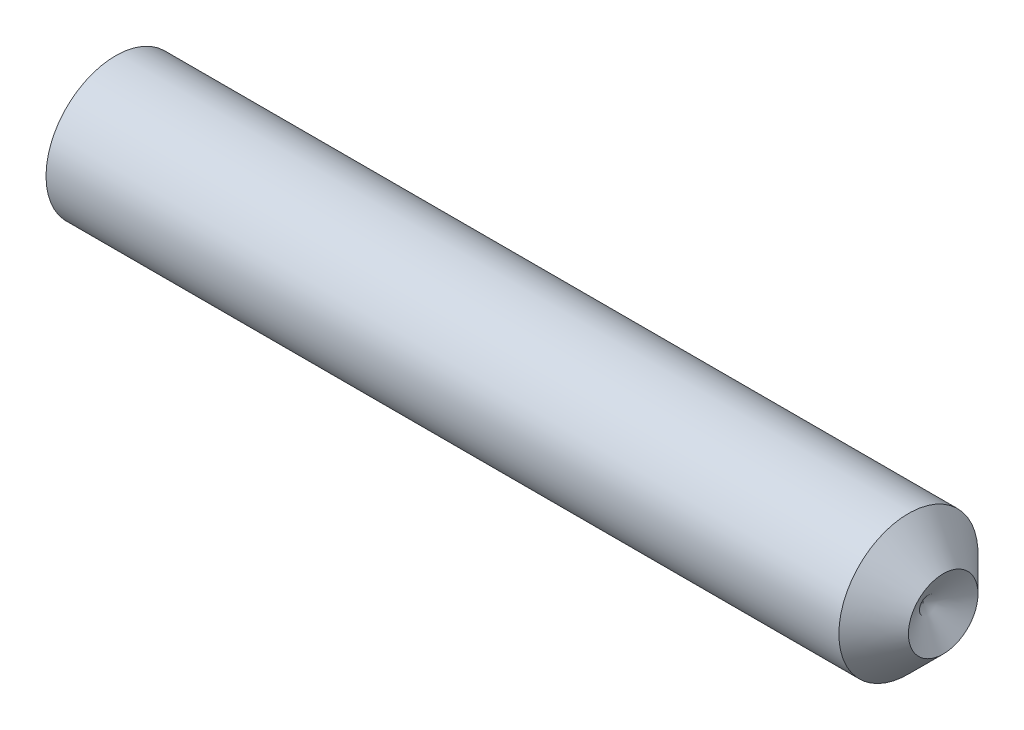
ISO-10303-21;
HEADER;
FILE_DESCRIPTION(('STEP AP214'),'2;1');
FILE_NAME('part.step','',(''),(''),'','','');
FILE_SCHEMA(('AUTOMOTIVE_DESIGN { 1 0 10303 214 1 1 1 1 }'));
ENDSEC;
DATA;
#1=APPLICATION_CONTEXT('core data for automotive mechanical design processes');
#2=APPLICATION_PROTOCOL_DEFINITION('international standard','automotive_design',2000,#1);
#3=PRODUCT_CONTEXT('',#1,'mechanical');
#4=PRODUCT('Part','Part','',(#3));
#5=PRODUCT_RELATED_PRODUCT_CATEGORY('part','',(#4));
#6=PRODUCT_DEFINITION_FORMATION('','',#4);
#7=PRODUCT_DEFINITION_CONTEXT('part definition',#1,'design');
#8=PRODUCT_DEFINITION('design','',#6,#7);
#9=PRODUCT_DEFINITION_SHAPE('','',#8);
#10=(LENGTH_UNIT() NAMED_UNIT(*) SI_UNIT(.MILLI.,.METRE.));
#11=(NAMED_UNIT(*) PLANE_ANGLE_UNIT() SI_UNIT($,.RADIAN.));
#12=(NAMED_UNIT(*) SI_UNIT($,.STERADIAN.) SOLID_ANGLE_UNIT());
#13=UNCERTAINTY_MEASURE_WITH_UNIT(LENGTH_MEASURE(1.E-05),#10,'distance_accuracy_value','');
#14=(GEOMETRIC_REPRESENTATION_CONTEXT(3) GLOBAL_UNCERTAINTY_ASSIGNED_CONTEXT((#13)) GLOBAL_UNIT_ASSIGNED_CONTEXT((#10,
#11,#12)) REPRESENTATION_CONTEXT('',''));
#15=CARTESIAN_POINT('',(0.,0.,0.));
#16=DIRECTION('',(0.,0.,1.));
#17=DIRECTION('',(1.,0.,0.));
#18=AXIS2_PLACEMENT_3D('',#15,#16,#17);
#19=CARTESIAN_POINT('',(0.,0.,0.));
#20=DIRECTION('',(-1.,0.,0.));
#21=DIRECTION('',(0.,0.,1.));
#22=AXIS2_PLACEMENT_3D('',#19,#20,#21);
#23=PLANE('',#22);
#24=CARTESIAN_POINT('',(0.,0.,0.));
#25=DIRECTION('',(-1.,0.,0.));
#26=DIRECTION('',(0.,0.,1.));
#27=AXIS2_PLACEMENT_3D('',#24,#25,#26);
#28=CIRCLE('',#27,2.055);
#29=CARTESIAN_POINT('',(0.,0.,2.055));
#30=VERTEX_POINT('',#29);
#31=EDGE_CURVE('E11',#30,#30,#28,.T.);
#32=ORIENTED_EDGE('',*,*,#31,.T.);
#33=EDGE_LOOP('',(#32));
#34=FACE_BOUND('',#33,.T.);
#35=DIRECTION('',(0.,0.,-1.));
#36=VECTOR('',#35,1.);
#37=CARTESIAN_POINT('',(0.,1.25,0.721687836487029));
#38=LINE('',#37,#36);
#39=CARTESIAN_POINT('',(0.,1.25,0.721687836487029));
#40=VERTEX_POINT('',#39);
#41=CARTESIAN_POINT('',(0.,1.25,-0.721687836487035));
#42=VERTEX_POINT('',#41);
#43=EDGE_CURVE('E98',#40,#42,#38,.T.);
#44=ORIENTED_EDGE('',*,*,#43,.F.);
#45=DIRECTION('',(0.,-0.866025403784439,0.5));
#46=VECTOR('',#45,1.);
#47=CARTESIAN_POINT('',(0.,1.25,0.721687836487029));
#48=LINE('',#47,#46);
#49=CARTESIAN_POINT('',(0.,0.,1.44337567297406));
#50=VERTEX_POINT('',#49);
#51=EDGE_CURVE('E51',#40,#50,#48,.T.);
#52=ORIENTED_EDGE('',*,*,#51,.T.);
#53=DIRECTION('',(0.,0.866025403784439,0.5));
#54=VECTOR('',#53,1.);
#55=CARTESIAN_POINT('',(0.,-1.25,0.721687836487029));
#56=LINE('',#55,#54);
#57=CARTESIAN_POINT('',(0.,-1.25,0.721687836487029));
#58=VERTEX_POINT('',#57);
#59=EDGE_CURVE('E104',#58,#50,#56,.T.);
#60=ORIENTED_EDGE('',*,*,#59,.F.);
#61=DIRECTION('',(0.,0.,-1.));
#62=VECTOR('',#61,1.);
#63=CARTESIAN_POINT('',(0.,-1.25,0.721687836487029));
#64=LINE('',#63,#62);
#65=CARTESIAN_POINT('',(0.,-1.25,-0.721687836487035));
#66=VERTEX_POINT('',#65);
#67=EDGE_CURVE('E124',#58,#66,#64,.T.);
#68=ORIENTED_EDGE('',*,*,#67,.T.);
#69=DIRECTION('',(0.,0.866025403784439,-0.5));
#70=VECTOR('',#69,1.);
#71=CARTESIAN_POINT('',(0.,-1.25,-0.721687836487035));
#72=LINE('',#71,#70);
#73=CARTESIAN_POINT('',(0.,0.,-1.44337567297407));
#74=VERTEX_POINT('',#73);
#75=EDGE_CURVE('E127',#66,#74,#72,.T.);
#76=ORIENTED_EDGE('',*,*,#75,.T.);
#77=DIRECTION('',(0.,-0.866025403784439,-0.5));
#78=VECTOR('',#77,1.);
#79=CARTESIAN_POINT('',(0.,1.25,-0.721687836487035));
#80=LINE('',#79,#78);
#81=EDGE_CURVE('E130',#42,#74,#80,.T.);
#82=ORIENTED_EDGE('',*,*,#81,.F.);
#83=EDGE_LOOP('',(#44,#52,#60,#68,#76,#82));
#84=FACE_BOUND('',#83,.T.);
#85=ADVANCED_FACE('F37',(#34,#84),#23,.T.);
#86=CARTESIAN_POINT('',(0.,0.,0.));
#87=DIRECTION('',(1.,0.,0.));
#88=DIRECTION('',(0.,0.,-1.));
#89=AXIS2_PLACEMENT_3D('',#86,#87,#88);
#90=CONICAL_SURFACE('',#89,2.055,1.0471975511966);
#91=CARTESIAN_POINT('',(0.256920869789382,0.,0.));
#92=DIRECTION('',(-1.,0.,0.));
#93=DIRECTION('',(0.,0.,1.));
#94=AXIS2_PLACEMENT_3D('',#91,#92,#93);
#95=CIRCLE('',#94,2.5);
#96=CARTESIAN_POINT('',(0.256920869789382,0.,2.5));
#97=VERTEX_POINT('',#96);
#98=EDGE_CURVE('E44',#97,#97,#95,.T.);
#99=ORIENTED_EDGE('',*,*,#98,.T.);
#100=EDGE_LOOP('',(#99));
#101=FACE_BOUND('',#100,.T.);
#102=ORIENTED_EDGE('',*,*,#31,.F.);
#103=EDGE_LOOP('',(#102));
#104=FACE_BOUND('',#103,.T.);
#105=ADVANCED_FACE('F150',(#101,#104),#90,.T.);
#106=CARTESIAN_POINT('',(-12.7,0.,0.));
#107=DIRECTION('',(-1.,0.,0.));
#108=DIRECTION('',(0.,0.,1.));
#109=AXIS2_PLACEMENT_3D('',#106,#107,#108);
#110=CYLINDRICAL_SURFACE('',#109,2.5);
#111=CARTESIAN_POINT('',(28.75,0.,0.));
#112=DIRECTION('',(-1.,0.,0.));
#113=DIRECTION('',(0.,0.,1.));
#114=AXIS2_PLACEMENT_3D('',#111,#112,#113);
#115=CIRCLE('',#114,2.5);
#116=CARTESIAN_POINT('',(28.75,0.,2.5));
#117=VERTEX_POINT('',#116);
#118=EDGE_CURVE('E145',#117,#117,#115,.T.);
#119=ORIENTED_EDGE('',*,*,#118,.T.);
#120=EDGE_LOOP('',(#119));
#121=FACE_BOUND('',#120,.T.);
#122=ORIENTED_EDGE('',*,*,#98,.F.);
#123=EDGE_LOOP('',(#122));
#124=FACE_BOUND('',#123,.T.);
#125=ADVANCED_FACE('F153',(#121,#124),#110,.T.);
#126=CARTESIAN_POINT('',(28.75,0.,0.));
#127=DIRECTION('',(-1.,0.,0.));
#128=DIRECTION('',(0.,0.,1.));
#129=AXIS2_PLACEMENT_3D('',#126,#127,#128);
#130=CONICAL_SURFACE('',#129,2.5,0.785398163397445);
#131=CARTESIAN_POINT('',(30.,0.,0.));
#132=DIRECTION('',(-1.,0.,0.));
#133=DIRECTION('',(0.,0.,1.));
#134=AXIS2_PLACEMENT_3D('',#131,#132,#133);
#135=CIRCLE('',#134,1.25);
#136=CARTESIAN_POINT('',(30.,0.,1.25));
#137=VERTEX_POINT('',#136);
#138=EDGE_CURVE('E105',#137,#137,#135,.T.);
#139=ORIENTED_EDGE('',*,*,#138,.T.);
#140=EDGE_LOOP('',(#139));
#141=FACE_BOUND('',#140,.T.);
#142=ORIENTED_EDGE('',*,*,#118,.F.);
#143=EDGE_LOOP('',(#142));
#144=FACE_BOUND('',#143,.T.);
#145=ADVANCED_FACE('F155',(#141,#144),#130,.T.);
#146=CARTESIAN_POINT('',(29.278312163513,0.,0.));
#147=DIRECTION('',(1.,0.,0.));
#148=DIRECTION('',(0.,0.,-1.));
#149=AXIS2_PLACEMENT_3D('',#146,#147,#148);
#150=CONICAL_SURFACE('',#149,0.,1.0471975511966);
#151=ORIENTED_EDGE('',*,*,#138,.F.);
#152=EDGE_LOOP('',(#151));
#153=FACE_BOUND('',#152,.T.);
#154=CARTESIAN_POINT('',(29.278312163513,0.,0.));
#155=VERTEX_POINT('',#154);
#156=VERTEX_LOOP('',#155);
#157=FACE_BOUND('',#156,.T.);
#158=ADVANCED_FACE('F162',(#153,#157),#150,.F.);
#159=CARTESIAN_POINT('',(2.,1.25,0.721687836487029));
#160=DIRECTION('',(0.,-0.5,-0.866025403784439));
#161=DIRECTION('',(0.,0.866025403784439,-0.5));
#162=AXIS2_PLACEMENT_3D('',#159,#160,#161);
#163=PLANE('',#162);
#164=ORIENTED_EDGE('',*,*,#51,.F.);
#165=DIRECTION('',(-1.,0.,0.));
#166=VECTOR('',#165,1.);
#167=CARTESIAN_POINT('',(2.,1.25,0.721687836487029));
#168=LINE('',#167,#166);
#169=CARTESIAN_POINT('',(2.,1.25,0.721687836487029));
#170=VERTEX_POINT('',#169);
#171=EDGE_CURVE('E92',#170,#40,#168,.T.);
#172=ORIENTED_EDGE('',*,*,#171,.F.);
#173=DIRECTION('',(0.,-0.866025403784439,0.5));
#174=VECTOR('',#173,1.);
#175=CARTESIAN_POINT('',(2.,1.25,0.721687836487029));
#176=LINE('',#175,#174);
#177=CARTESIAN_POINT('',(2.,0.,1.44337567297406));
#178=VERTEX_POINT('',#177);
#179=EDGE_CURVE('E87',#170,#178,#176,.T.);
#180=ORIENTED_EDGE('',*,*,#179,.T.);
#181=DIRECTION('',(-1.,0.,0.));
#182=VECTOR('',#181,1.);
#183=CARTESIAN_POINT('',(2.,0.,1.44337567297406));
#184=LINE('',#183,#182);
#185=EDGE_CURVE('E90',#178,#50,#184,.T.);
#186=ORIENTED_EDGE('',*,*,#185,.T.);
#187=EDGE_LOOP('',(#164,#172,#180,#186));
#188=FACE_BOUND('',#187,.T.);
#189=ADVANCED_FACE('F89',(#188),#163,.T.);
#190=CARTESIAN_POINT('',(2.,-1.25,0.721687836487029));
#191=DIRECTION('',(0.,-0.5,0.866025403784439));
#192=DIRECTION('',(0.,-0.866025403784439,-0.5));
#193=AXIS2_PLACEMENT_3D('',#190,#191,#192);
#194=PLANE('',#193);
#195=ORIENTED_EDGE('',*,*,#59,.T.);
#196=ORIENTED_EDGE('',*,*,#185,.F.);
#197=DIRECTION('',(0.,0.866025403784439,0.5));
#198=VECTOR('',#197,1.);
#199=CARTESIAN_POINT('',(2.,-1.25,0.721687836487029));
#200=LINE('',#199,#198);
#201=CARTESIAN_POINT('',(2.,-1.25,0.721687836487029));
#202=VERTEX_POINT('',#201);
#203=EDGE_CURVE('E97',#202,#178,#200,.T.);
#204=ORIENTED_EDGE('',*,*,#203,.F.);
#205=DIRECTION('',(-1.,0.,0.));
#206=VECTOR('',#205,1.);
#207=CARTESIAN_POINT('',(2.,-1.25,0.721687836487029));
#208=LINE('',#207,#206);
#209=EDGE_CURVE('E106',#202,#58,#208,.T.);
#210=ORIENTED_EDGE('',*,*,#209,.T.);
#211=EDGE_LOOP('',(#195,#196,#204,#210));
#212=FACE_BOUND('',#211,.T.);
#213=ADVANCED_FACE('F102',(#212),#194,.F.);
#214=CARTESIAN_POINT('',(2.,-1.25,0.721687836487029));
#215=DIRECTION('',(0.,1.,0.));
#216=DIRECTION('',(0.,0.,1.));
#217=AXIS2_PLACEMENT_3D('',#214,#215,#216);
#218=PLANE('',#217);
#219=ORIENTED_EDGE('',*,*,#67,.F.);
#220=ORIENTED_EDGE('',*,*,#209,.F.);
#221=DIRECTION('',(0.,0.,-1.));
#222=VECTOR('',#221,1.);
#223=CARTESIAN_POINT('',(2.,-1.25,0.721687836487029));
#224=LINE('',#223,#222);
#225=CARTESIAN_POINT('',(2.,-1.25,-0.721687836487035));
#226=VERTEX_POINT('',#225);
#227=EDGE_CURVE('E111',#202,#226,#224,.T.);
#228=ORIENTED_EDGE('',*,*,#227,.T.);
#229=DIRECTION('',(-1.,0.,0.));
#230=VECTOR('',#229,1.);
#231=CARTESIAN_POINT('',(2.,-1.25,-0.721687836487035));
#232=LINE('',#231,#230);
#233=EDGE_CURVE('E140',#226,#66,#232,.T.);
#234=ORIENTED_EDGE('',*,*,#233,.T.);
#235=EDGE_LOOP('',(#219,#220,#228,#234));
#236=FACE_BOUND('',#235,.T.);
#237=ADVANCED_FACE('F185',(#236),#218,.T.);
#238=CARTESIAN_POINT('',(2.,-1.25,-0.721687836487035));
#239=DIRECTION('',(0.,0.5,0.866025403784439));
#240=DIRECTION('',(0.,-0.866025403784439,0.5));
#241=AXIS2_PLACEMENT_3D('',#238,#239,#240);
#242=PLANE('',#241);
#243=ORIENTED_EDGE('',*,*,#75,.F.);
#244=ORIENTED_EDGE('',*,*,#233,.F.);
#245=DIRECTION('',(0.,0.866025403784439,-0.5));
#246=VECTOR('',#245,1.);
#247=CARTESIAN_POINT('',(2.,-1.25,-0.721687836487035));
#248=LINE('',#247,#246);
#249=CARTESIAN_POINT('',(2.,0.,-1.44337567297407));
#250=VERTEX_POINT('',#249);
#251=EDGE_CURVE('E113',#226,#250,#248,.T.);
#252=ORIENTED_EDGE('',*,*,#251,.T.);
#253=DIRECTION('',(-1.,0.,0.));
#254=VECTOR('',#253,1.);
#255=CARTESIAN_POINT('',(2.,0.,-1.44337567297407));
#256=LINE('',#255,#254);
#257=EDGE_CURVE('E138',#250,#74,#256,.T.);
#258=ORIENTED_EDGE('',*,*,#257,.T.);
#259=EDGE_LOOP('',(#243,#244,#252,#258));
#260=FACE_BOUND('',#259,.T.);
#261=ADVANCED_FACE('F181',(#260),#242,.T.);
#262=CARTESIAN_POINT('',(2.,1.25,-0.721687836487035));
#263=DIRECTION('',(0.,0.5,-0.866025403784439));
#264=DIRECTION('',(0.,0.866025403784439,0.5));
#265=AXIS2_PLACEMENT_3D('',#262,#263,#264);
#266=PLANE('',#265);
#267=ORIENTED_EDGE('',*,*,#81,.T.);
#268=ORIENTED_EDGE('',*,*,#257,.F.);
#269=DIRECTION('',(0.,-0.866025403784439,-0.5));
#270=VECTOR('',#269,1.);
#271=CARTESIAN_POINT('',(2.,1.25,-0.721687836487035));
#272=LINE('',#271,#270);
#273=CARTESIAN_POINT('',(2.,1.25,-0.721687836487035));
#274=VERTEX_POINT('',#273);
#275=EDGE_CURVE('E117',#274,#250,#272,.T.);
#276=ORIENTED_EDGE('',*,*,#275,.F.);
#277=DIRECTION('',(-1.,0.,0.));
#278=VECTOR('',#277,1.);
#279=CARTESIAN_POINT('',(2.,1.25,-0.721687836487035));
#280=LINE('',#279,#278);
#281=EDGE_CURVE('E136',#274,#42,#280,.T.);
#282=ORIENTED_EDGE('',*,*,#281,.T.);
#283=EDGE_LOOP('',(#267,#268,#276,#282));
#284=FACE_BOUND('',#283,.T.);
#285=ADVANCED_FACE('F178',(#284),#266,.F.);
#286=CARTESIAN_POINT('',(2.,1.25,0.721687836487029));
#287=DIRECTION('',(0.,1.,0.));
#288=DIRECTION('',(0.,0.,1.));
#289=AXIS2_PLACEMENT_3D('',#286,#287,#288);
#290=PLANE('',#289);
#291=ORIENTED_EDGE('',*,*,#43,.T.);
#292=ORIENTED_EDGE('',*,*,#281,.F.);
#293=DIRECTION('',(0.,0.,-1.));
#294=VECTOR('',#293,1.);
#295=CARTESIAN_POINT('',(2.,1.25,0.721687836487029));
#296=LINE('',#295,#294);
#297=EDGE_CURVE('E120',#170,#274,#296,.T.);
#298=ORIENTED_EDGE('',*,*,#297,.F.);
#299=ORIENTED_EDGE('',*,*,#171,.T.);
#300=EDGE_LOOP('',(#291,#292,#298,#299));
#301=FACE_BOUND('',#300,.T.);
#302=ADVANCED_FACE('F174',(#301),#290,.F.);
#303=CARTESIAN_POINT('',(2.,1.25,0.721687836487029));
#304=DIRECTION('',(1.,0.,0.));
#305=DIRECTION('',(0.,0.,-1.));
#306=AXIS2_PLACEMENT_3D('',#303,#304,#305);
#307=PLANE('',#306);
#308=ORIENTED_EDGE('',*,*,#179,.F.);
#309=ORIENTED_EDGE('',*,*,#297,.T.);
#310=ORIENTED_EDGE('',*,*,#275,.T.);
#311=ORIENTED_EDGE('',*,*,#251,.F.);
#312=ORIENTED_EDGE('',*,*,#227,.F.);
#313=ORIENTED_EDGE('',*,*,#203,.T.);
#314=EDGE_LOOP('',(#308,#309,#310,#311,#312,#313));
#315=FACE_BOUND('',#314,.T.);
#316=ADVANCED_FACE('F109',(#315),#307,.F.);
#317=CLOSED_SHELL('',(#85,#105,#125,#145,#158,#189,#213,#237,#261,#285,#302,#316));
#318=MANIFOLD_SOLID_BREP('B2',#317);
#319=ADVANCED_BREP_SHAPE_REPRESENTATION('',(#18,#318),#14);
#320=SHAPE_DEFINITION_REPRESENTATION(#9,#319);
ENDSEC;
END-ISO-10303-21;
